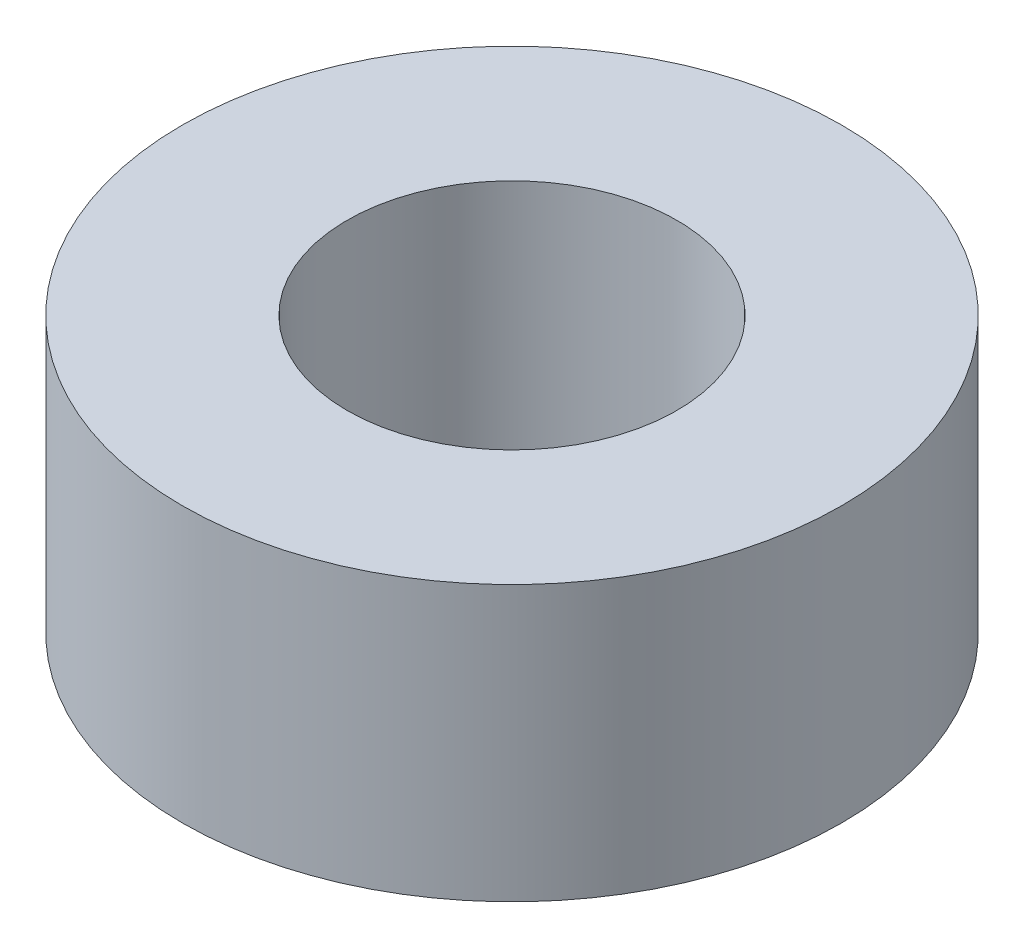
ISO-10303-21;
HEADER;
FILE_DESCRIPTION(('STEP AP214'),'2;1');
FILE_NAME('part.step','',(''),(''),'','','');
FILE_SCHEMA(('AUTOMOTIVE_DESIGN { 1 0 10303 214 1 1 1 1 }'));
ENDSEC;
DATA;
#1=APPLICATION_CONTEXT('core data for automotive mechanical design processes');
#2=APPLICATION_PROTOCOL_DEFINITION('international standard','automotive_design',2000,#1);
#3=PRODUCT_CONTEXT('',#1,'mechanical');
#4=PRODUCT('Part','Part','',(#3));
#5=PRODUCT_RELATED_PRODUCT_CATEGORY('part','',(#4));
#6=PRODUCT_DEFINITION_FORMATION('','',#4);
#7=PRODUCT_DEFINITION_CONTEXT('part definition',#1,'design');
#8=PRODUCT_DEFINITION('design','',#6,#7);
#9=PRODUCT_DEFINITION_SHAPE('','',#8);
#10=(LENGTH_UNIT() NAMED_UNIT(*) SI_UNIT(.MILLI.,.METRE.));
#11=(NAMED_UNIT(*) PLANE_ANGLE_UNIT() SI_UNIT($,.RADIAN.));
#12=(NAMED_UNIT(*) SI_UNIT($,.STERADIAN.) SOLID_ANGLE_UNIT());
#13=UNCERTAINTY_MEASURE_WITH_UNIT(LENGTH_MEASURE(1.E-05),#10,'distance_accuracy_value','');
#14=(GEOMETRIC_REPRESENTATION_CONTEXT(3) GLOBAL_UNCERTAINTY_ASSIGNED_CONTEXT((#13)) GLOBAL_UNIT_ASSIGNED_CONTEXT((#10,
#11,#12)) REPRESENTATION_CONTEXT('',''));
#15=CARTESIAN_POINT('',(0.,0.,0.));
#16=DIRECTION('',(0.,0.,1.));
#17=DIRECTION('',(1.,0.,0.));
#18=AXIS2_PLACEMENT_3D('',#15,#16,#17);
#19=CARTESIAN_POINT('',(0.,2.5,0.));
#20=DIRECTION('',(0.,1.,0.));
#21=DIRECTION('',(0.,0.,1.));
#22=AXIS2_PLACEMENT_3D('',#19,#20,#21);
#23=PLANE('',#22);
#24=CARTESIAN_POINT('',(0.,2.5,0.));
#25=DIRECTION('',(0.,1.,0.));
#26=DIRECTION('',(0.,0.,1.));
#27=AXIS2_PLACEMENT_3D('',#24,#25,#26);
#28=CIRCLE('',#27,3.);
#29=CARTESIAN_POINT('',(0.,2.5,3.));
#30=VERTEX_POINT('',#29);
#31=EDGE_CURVE('E10',#30,#30,#28,.T.);
#32=ORIENTED_EDGE('',*,*,#31,.T.);
#33=EDGE_LOOP('',(#32));
#34=FACE_BOUND('',#33,.T.);
#35=CARTESIAN_POINT('',(0.,2.5,0.));
#36=DIRECTION('',(0.,1.,0.));
#37=DIRECTION('',(0.,0.,1.));
#38=AXIS2_PLACEMENT_3D('',#35,#36,#37);
#39=CIRCLE('',#38,1.5);
#40=CARTESIAN_POINT('',(0.,2.5,1.5));
#41=VERTEX_POINT('',#40);
#42=EDGE_CURVE('E45',#41,#41,#39,.T.);
#43=ORIENTED_EDGE('',*,*,#42,.F.);
#44=EDGE_LOOP('',(#43));
#45=FACE_BOUND('',#44,.T.);
#46=ADVANCED_FACE('F34',(#34,#45),#23,.T.);
#47=CARTESIAN_POINT('',(0.,0.,0.));
#48=DIRECTION('',(0.,1.,0.));
#49=DIRECTION('',(0.,0.,1.));
#50=AXIS2_PLACEMENT_3D('',#47,#48,#49);
#51=PLANE('',#50);
#52=CARTESIAN_POINT('',(0.,0.,0.));
#53=DIRECTION('',(0.,1.,0.));
#54=DIRECTION('',(0.,0.,1.));
#55=AXIS2_PLACEMENT_3D('',#52,#53,#54);
#56=CIRCLE('',#55,3.);
#57=CARTESIAN_POINT('',(0.,0.,3.));
#58=VERTEX_POINT('',#57);
#59=EDGE_CURVE('E38',#58,#58,#56,.T.);
#60=ORIENTED_EDGE('',*,*,#59,.F.);
#61=EDGE_LOOP('',(#60));
#62=FACE_BOUND('',#61,.T.);
#63=CARTESIAN_POINT('',(0.,0.,0.));
#64=DIRECTION('',(0.,1.,0.));
#65=DIRECTION('',(0.,0.,1.));
#66=AXIS2_PLACEMENT_3D('',#63,#64,#65);
#67=CIRCLE('',#66,1.5);
#68=CARTESIAN_POINT('',(0.,0.,1.5));
#69=VERTEX_POINT('',#68);
#70=EDGE_CURVE('E47',#69,#69,#67,.T.);
#71=ORIENTED_EDGE('',*,*,#70,.T.);
#72=EDGE_LOOP('',(#71));
#73=FACE_BOUND('',#72,.T.);
#74=ADVANCED_FACE('F57',(#62,#73),#51,.F.);
#75=CARTESIAN_POINT('',(0.,2.5,0.));
#76=DIRECTION('',(0.,-1.,0.));
#77=DIRECTION('',(0.,0.,-1.));
#78=AXIS2_PLACEMENT_3D('',#75,#76,#77);
#79=CYLINDRICAL_SURFACE('',#78,3.);
#80=ORIENTED_EDGE('',*,*,#31,.F.);
#81=EDGE_LOOP('',(#80));
#82=FACE_BOUND('',#81,.T.);
#83=ORIENTED_EDGE('',*,*,#59,.T.);
#84=EDGE_LOOP('',(#83));
#85=FACE_BOUND('',#84,.T.);
#86=ADVANCED_FACE('F36',(#82,#85),#79,.T.);
#87=CARTESIAN_POINT('',(0.,2.5,0.));
#88=DIRECTION('',(0.,-1.,0.));
#89=DIRECTION('',(0.,0.,-1.));
#90=AXIS2_PLACEMENT_3D('',#87,#88,#89);
#91=CYLINDRICAL_SURFACE('',#90,1.5);
#92=ORIENTED_EDGE('',*,*,#42,.T.);
#93=EDGE_LOOP('',(#92));
#94=FACE_BOUND('',#93,.T.);
#95=ORIENTED_EDGE('',*,*,#70,.F.);
#96=EDGE_LOOP('',(#95));
#97=FACE_BOUND('',#96,.T.);
#98=ADVANCED_FACE('F53',(#94,#97),#91,.F.);
#99=CLOSED_SHELL('',(#46,#74,#86,#98));
#100=MANIFOLD_SOLID_BREP('B2',#99);
#101=ADVANCED_BREP_SHAPE_REPRESENTATION('',(#18,#100),#14);
#102=SHAPE_DEFINITION_REPRESENTATION(#9,#101);
ENDSEC;
END-ISO-10303-21;
